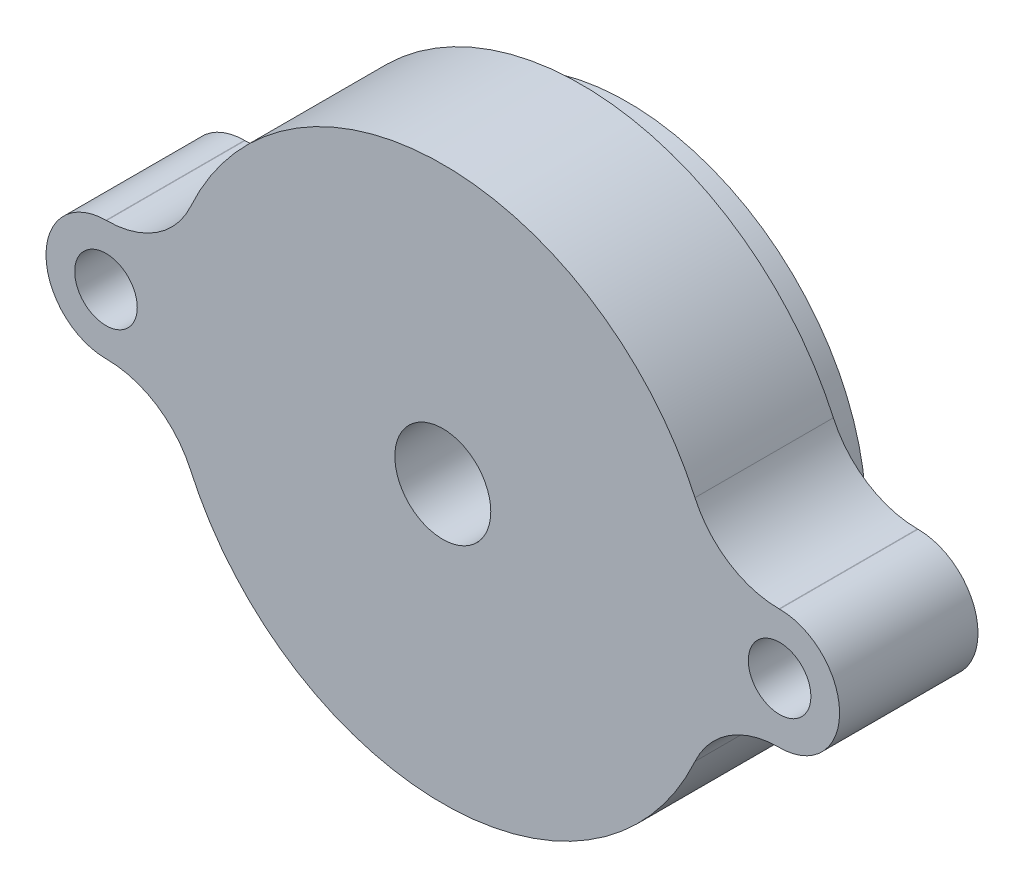
ISO-10303-21;
HEADER;
FILE_DESCRIPTION(('STEP AP214'),'2;1');
FILE_NAME('part.step','',(''),(''),'','','');
FILE_SCHEMA(('AUTOMOTIVE_DESIGN { 1 0 10303 214 1 1 1 1 }'));
ENDSEC;
DATA;
#1=APPLICATION_CONTEXT('core data for automotive mechanical design processes');
#2=APPLICATION_PROTOCOL_DEFINITION('international standard','automotive_design',2000,#1);
#3=PRODUCT_CONTEXT('',#1,'mechanical');
#4=PRODUCT('Part','Part','',(#3));
#5=PRODUCT_RELATED_PRODUCT_CATEGORY('part','',(#4));
#6=PRODUCT_DEFINITION_FORMATION('','',#4);
#7=PRODUCT_DEFINITION_CONTEXT('part definition',#1,'design');
#8=PRODUCT_DEFINITION('design','',#6,#7);
#9=PRODUCT_DEFINITION_SHAPE('','',#8);
#10=(LENGTH_UNIT() NAMED_UNIT(*) SI_UNIT(.MILLI.,.METRE.));
#11=(NAMED_UNIT(*) PLANE_ANGLE_UNIT() SI_UNIT($,.RADIAN.));
#12=(NAMED_UNIT(*) SI_UNIT($,.STERADIAN.) SOLID_ANGLE_UNIT());
#13=UNCERTAINTY_MEASURE_WITH_UNIT(LENGTH_MEASURE(1.E-05),#10,'distance_accuracy_value','');
#14=(GEOMETRIC_REPRESENTATION_CONTEXT(3) GLOBAL_UNCERTAINTY_ASSIGNED_CONTEXT((#13)) GLOBAL_UNIT_ASSIGNED_CONTEXT((#10,
#11,#12)) REPRESENTATION_CONTEXT('',''));
#15=CARTESIAN_POINT('',(0.,0.,0.));
#16=DIRECTION('',(0.,0.,1.));
#17=DIRECTION('',(1.,0.,0.));
#18=AXIS2_PLACEMENT_3D('',#15,#16,#17);
#19=CARTESIAN_POINT('',(23.1775,0.,3.175));
#20=DIRECTION('',(0.,0.,1.));
#21=DIRECTION('',(1.,0.,0.));
#22=AXIS2_PLACEMENT_3D('',#19,#20,#21);
#23=PLANE('',#22);
#24=CARTESIAN_POINT('',(23.1775,0.,3.175));
#25=DIRECTION('',(0.,0.,-1.));
#26=DIRECTION('',(-1.,0.,0.));
#27=AXIS2_PLACEMENT_3D('',#24,#25,#26);
#28=CIRCLE('',#27,2.65430000000001);
#29=CARTESIAN_POINT('',(20.5232,0.,3.175));
#30=VERTEX_POINT('',#29);
#31=EDGE_CURVE('E252',#30,#30,#28,.T.);
#32=ORIENTED_EDGE('',*,*,#31,.F.);
#33=EDGE_LOOP('',(#32));
#34=FACE_BOUND('',#33,.T.);
#35=CARTESIAN_POINT('',(-23.1775,0.,3.175));
#36=DIRECTION('',(0.,0.,-1.));
#37=DIRECTION('',(-1.,0.,0.));
#38=AXIS2_PLACEMENT_3D('',#35,#36,#37);
#39=CIRCLE('',#38,2.65430000000001);
#40=CARTESIAN_POINT('',(-25.8318,0.,3.175));
#41=VERTEX_POINT('',#40);
#42=EDGE_CURVE('E242',#41,#41,#39,.T.);
#43=ORIENTED_EDGE('',*,*,#42,.F.);
#44=EDGE_LOOP('',(#43));
#45=FACE_BOUND('',#44,.T.);
#46=CARTESIAN_POINT('',(0.,0.,3.175));
#47=DIRECTION('',(0.,0.,1.));
#48=DIRECTION('',(1.,0.,0.));
#49=AXIS2_PLACEMENT_3D('',#46,#47,#48);
#50=CIRCLE('',#49,16.4211);
#51=CARTESIAN_POINT('',(16.4211,0.,3.175));
#52=VERTEX_POINT('',#51);
#53=EDGE_CURVE('E12',#52,#52,#50,.T.);
#54=ORIENTED_EDGE('',*,*,#53,.T.);
#55=EDGE_LOOP('',(#54));
#56=FACE_BOUND('',#55,.T.);
#57=CARTESIAN_POINT('',(23.1775,0.,3.175));
#58=DIRECTION('',(0.,0.,1.));
#59=DIRECTION('',(1.,0.,0.));
#60=AXIS2_PLACEMENT_3D('',#57,#58,#59);
#61=CIRCLE('',#60,4.1275);
#62=CARTESIAN_POINT('',(23.1775,-4.1275,3.175));
#63=VERTEX_POINT('',#62);
#64=CARTESIAN_POINT('',(23.1775,4.1275,3.175));
#65=VERTEX_POINT('',#64);
#66=EDGE_CURVE('E149',#63,#65,#61,.T.);
#67=ORIENTED_EDGE('',*,*,#66,.F.);
#68=DIRECTION('',(1.,0.,0.));
#69=VECTOR('',#68,1.);
#70=CARTESIAN_POINT('',(23.1383230539726,-4.1275,3.175));
#71=LINE('',#70,#69);
#72=CARTESIAN_POINT('',(23.1383230539726,-4.1275,3.175));
#73=VERTEX_POINT('',#72);
#74=EDGE_CURVE('E189',#73,#63,#71,.T.);
#75=ORIENTED_EDGE('',*,*,#74,.F.);
#76=CARTESIAN_POINT('',(23.1383230539726,-10.4775,3.175));
#77=DIRECTION('',(0.,0.,-1.));
#78=DIRECTION('',(1.,0.,0.));
#79=AXIS2_PLACEMENT_3D('',#76,#77,#78);
#80=CIRCLE('',#79,6.35);
#81=CARTESIAN_POINT('',(17.3537422904795,-7.85812500000001,3.175));
#82=VERTEX_POINT('',#81);
#83=EDGE_CURVE('E186',#82,#73,#80,.T.);
#84=ORIENTED_EDGE('',*,*,#83,.F.);
#85=CARTESIAN_POINT('',(0.,0.,3.175));
#86=DIRECTION('',(0.,0.,1.));
#87=DIRECTION('',(1.,0.,0.));
#88=AXIS2_PLACEMENT_3D('',#85,#86,#87);
#89=CIRCLE('',#88,19.05);
#90=CARTESIAN_POINT('',(-17.3537422904795,-7.858125,3.175));
#91=VERTEX_POINT('',#90);
#92=EDGE_CURVE('E183',#91,#82,#89,.T.);
#93=ORIENTED_EDGE('',*,*,#92,.F.);
#94=CARTESIAN_POINT('',(-23.1383230539726,-10.4775,3.175));
#95=DIRECTION('',(0.,0.,-1.));
#96=DIRECTION('',(1.,0.,0.));
#97=AXIS2_PLACEMENT_3D('',#94,#95,#96);
#98=CIRCLE('',#97,6.35);
#99=CARTESIAN_POINT('',(-23.1383230539726,-4.1275,3.175));
#100=VERTEX_POINT('',#99);
#101=EDGE_CURVE('E180',#100,#91,#98,.T.);
#102=ORIENTED_EDGE('',*,*,#101,.F.);
#103=DIRECTION('',(1.,0.,0.));
#104=VECTOR('',#103,1.);
#105=CARTESIAN_POINT('',(-23.1775,-4.1275,3.175));
#106=LINE('',#105,#104);
#107=CARTESIAN_POINT('',(-23.1775,-4.1275,3.175));
#108=VERTEX_POINT('',#107);
#109=EDGE_CURVE('E177',#108,#100,#106,.T.);
#110=ORIENTED_EDGE('',*,*,#109,.F.);
#111=CARTESIAN_POINT('',(-23.1775,0.,3.175));
#112=DIRECTION('',(0.,0.,1.));
#113=DIRECTION('',(1.,0.,0.));
#114=AXIS2_PLACEMENT_3D('',#111,#112,#113);
#115=CIRCLE('',#114,4.1275);
#116=CARTESIAN_POINT('',(-23.1775,4.1275,3.175));
#117=VERTEX_POINT('',#116);
#118=EDGE_CURVE('E174',#117,#108,#115,.T.);
#119=ORIENTED_EDGE('',*,*,#118,.F.);
#120=DIRECTION('',(-1.,0.,0.));
#121=VECTOR('',#120,1.);
#122=CARTESIAN_POINT('',(-23.1383230539726,4.1275,3.175));
#123=LINE('',#122,#121);
#124=CARTESIAN_POINT('',(-23.1383230539726,4.1275,3.175));
#125=VERTEX_POINT('',#124);
#126=EDGE_CURVE('E171',#125,#117,#123,.T.);
#127=ORIENTED_EDGE('',*,*,#126,.F.);
#128=CARTESIAN_POINT('',(-23.1383230539726,10.4775,3.175));
#129=DIRECTION('',(0.,0.,-1.));
#130=DIRECTION('',(1.,0.,0.));
#131=AXIS2_PLACEMENT_3D('',#128,#129,#130);
#132=CIRCLE('',#131,6.35);
#133=CARTESIAN_POINT('',(-17.3537422904795,7.858125,3.175));
#134=VERTEX_POINT('',#133);
#135=EDGE_CURVE('E168',#134,#125,#132,.T.);
#136=ORIENTED_EDGE('',*,*,#135,.F.);
#137=CARTESIAN_POINT('',(0.,0.,3.175));
#138=DIRECTION('',(0.,0.,1.));
#139=DIRECTION('',(1.,0.,0.));
#140=AXIS2_PLACEMENT_3D('',#137,#138,#139);
#141=CIRCLE('',#140,19.05);
#142=CARTESIAN_POINT('',(17.3537422904795,7.858125,3.175));
#143=VERTEX_POINT('',#142);
#144=EDGE_CURVE('E165',#143,#134,#141,.T.);
#145=ORIENTED_EDGE('',*,*,#144,.F.);
#146=CARTESIAN_POINT('',(23.1383230539726,10.4775,3.175));
#147=DIRECTION('',(0.,0.,-1.));
#148=DIRECTION('',(1.,0.,0.));
#149=AXIS2_PLACEMENT_3D('',#146,#147,#148);
#150=CIRCLE('',#149,6.35);
#151=CARTESIAN_POINT('',(23.1383230539726,4.1275,3.175));
#152=VERTEX_POINT('',#151);
#153=EDGE_CURVE('E153',#152,#143,#150,.T.);
#154=ORIENTED_EDGE('',*,*,#153,.F.);
#155=DIRECTION('',(-1.,0.,0.));
#156=VECTOR('',#155,1.);
#157=CARTESIAN_POINT('',(23.1775,4.1275,3.175));
#158=LINE('',#157,#156);
#159=EDGE_CURVE('E137',#65,#152,#158,.T.);
#160=ORIENTED_EDGE('',*,*,#159,.F.);
#161=EDGE_LOOP('',(#67,#75,#84,#93,#102,#110,#119,#127,#136,#145,#154,#160));
#162=FACE_BOUND('',#161,.T.);
#163=ADVANCED_FACE('F42',(#34,#45,#56,#162),#23,.F.);
#164=CARTESIAN_POINT('',(0.,0.,6.35));
#165=DIRECTION('',(0.,0.,-1.));
#166=DIRECTION('',(-1.,0.,0.));
#167=AXIS2_PLACEMENT_3D('',#164,#165,#166);
#168=CYLINDRICAL_SURFACE('',#167,16.4211);
#169=CARTESIAN_POINT('',(0.,0.,0.));
#170=DIRECTION('',(0.,0.,1.));
#171=DIRECTION('',(1.,0.,0.));
#172=AXIS2_PLACEMENT_3D('',#169,#170,#171);
#173=CIRCLE('',#172,16.4211);
#174=CARTESIAN_POINT('',(16.4211,0.,0.));
#175=VERTEX_POINT('',#174);
#176=EDGE_CURVE('E51',#175,#175,#173,.T.);
#177=ORIENTED_EDGE('',*,*,#176,.T.);
#178=EDGE_LOOP('',(#177));
#179=FACE_BOUND('',#178,.T.);
#180=ORIENTED_EDGE('',*,*,#53,.F.);
#181=EDGE_LOOP('',(#180));
#182=FACE_BOUND('',#181,.T.);
#183=ADVANCED_FACE('F277',(#179,#182),#168,.T.);
#184=CARTESIAN_POINT('',(0.,0.,6.35));
#185=DIRECTION('',(0.,0.,-1.));
#186=DIRECTION('',(-1.,0.,0.));
#187=AXIS2_PLACEMENT_3D('',#184,#185,#186);
#188=CYLINDRICAL_SURFACE('',#187,3.302);
#189=CARTESIAN_POINT('',(0.,0.,0.));
#190=DIRECTION('',(0.,0.,1.));
#191=DIRECTION('',(1.,0.,0.));
#192=AXIS2_PLACEMENT_3D('',#189,#190,#191);
#193=CIRCLE('',#192,3.302);
#194=CARTESIAN_POINT('',(3.302,0.,0.));
#195=VERTEX_POINT('',#194);
#196=EDGE_CURVE('E142',#195,#195,#193,.T.);
#197=ORIENTED_EDGE('',*,*,#196,.F.);
#198=EDGE_LOOP('',(#197));
#199=FACE_BOUND('',#198,.T.);
#200=CARTESIAN_POINT('',(0.,0.,12.7));
#201=DIRECTION('',(0.,0.,1.));
#202=DIRECTION('',(1.,0.,0.));
#203=AXIS2_PLACEMENT_3D('',#200,#201,#202);
#204=CIRCLE('',#203,3.302);
#205=CARTESIAN_POINT('',(3.302,0.,12.7));
#206=VERTEX_POINT('',#205);
#207=EDGE_CURVE('E255',#206,#206,#204,.T.);
#208=ORIENTED_EDGE('',*,*,#207,.T.);
#209=EDGE_LOOP('',(#208));
#210=FACE_BOUND('',#209,.T.);
#211=ADVANCED_FACE('F44',(#199,#210),#188,.F.);
#212=CARTESIAN_POINT('',(0.,0.,0.));
#213=DIRECTION('',(0.,0.,1.));
#214=DIRECTION('',(1.,0.,0.));
#215=AXIS2_PLACEMENT_3D('',#212,#213,#214);
#216=PLANE('',#215);
#217=ORIENTED_EDGE('',*,*,#196,.T.);
#218=EDGE_LOOP('',(#217));
#219=FACE_BOUND('',#218,.T.);
#220=ORIENTED_EDGE('',*,*,#176,.F.);
#221=EDGE_LOOP('',(#220));
#222=FACE_BOUND('',#221,.T.);
#223=ADVANCED_FACE('F262',(#219,#222),#216,.F.);
#224=CARTESIAN_POINT('',(23.1775,0.,12.7));
#225=DIRECTION('',(0.,0.,1.));
#226=DIRECTION('',(1.,0.,0.));
#227=AXIS2_PLACEMENT_3D('',#224,#225,#226);
#228=PLANE('',#227);
#229=CARTESIAN_POINT('',(23.1775,0.,12.7));
#230=DIRECTION('',(0.,0.,1.));
#231=DIRECTION('',(1.,0.,0.));
#232=AXIS2_PLACEMENT_3D('',#229,#230,#231);
#233=CIRCLE('',#232,2.15264999999999);
#234=CARTESIAN_POINT('',(25.33015,0.,12.7));
#235=VERTEX_POINT('',#234);
#236=EDGE_CURVE('E160',#235,#235,#233,.T.);
#237=ORIENTED_EDGE('',*,*,#236,.F.);
#238=EDGE_LOOP('',(#237));
#239=FACE_BOUND('',#238,.T.);
#240=CARTESIAN_POINT('',(-23.1775,0.,12.7));
#241=DIRECTION('',(0.,0.,1.));
#242=DIRECTION('',(1.,0.,0.));
#243=AXIS2_PLACEMENT_3D('',#240,#241,#242);
#244=CIRCLE('',#243,2.15264999999999);
#245=CARTESIAN_POINT('',(-21.02485,0.,12.7));
#246=VERTEX_POINT('',#245);
#247=EDGE_CURVE('E157',#246,#246,#244,.T.);
#248=ORIENTED_EDGE('',*,*,#247,.F.);
#249=EDGE_LOOP('',(#248));
#250=FACE_BOUND('',#249,.T.);
#251=CARTESIAN_POINT('',(23.1775,0.,12.7));
#252=DIRECTION('',(0.,0.,1.));
#253=DIRECTION('',(1.,0.,0.));
#254=AXIS2_PLACEMENT_3D('',#251,#252,#253);
#255=CIRCLE('',#254,4.1275);
#256=CARTESIAN_POINT('',(23.1775,-4.1275,12.7));
#257=VERTEX_POINT('',#256);
#258=CARTESIAN_POINT('',(23.1775,4.1275,12.7));
#259=VERTEX_POINT('',#258);
#260=EDGE_CURVE('E191',#257,#259,#255,.T.);
#261=ORIENTED_EDGE('',*,*,#260,.T.);
#262=DIRECTION('',(-1.,0.,0.));
#263=VECTOR('',#262,1.);
#264=CARTESIAN_POINT('',(23.1775,4.1275,12.7));
#265=LINE('',#264,#263);
#266=CARTESIAN_POINT('',(23.1383230539726,4.1275,12.7));
#267=VERTEX_POINT('',#266);
#268=EDGE_CURVE('E138',#259,#267,#265,.T.);
#269=ORIENTED_EDGE('',*,*,#268,.T.);
#270=CARTESIAN_POINT('',(23.1383230539726,10.4775,12.7));
#271=DIRECTION('',(0.,0.,-1.));
#272=DIRECTION('',(1.,0.,0.));
#273=AXIS2_PLACEMENT_3D('',#270,#271,#272);
#274=CIRCLE('',#273,6.35);
#275=CARTESIAN_POINT('',(17.3537422904795,7.858125,12.7));
#276=VERTEX_POINT('',#275);
#277=EDGE_CURVE('E194',#267,#276,#274,.T.);
#278=ORIENTED_EDGE('',*,*,#277,.T.);
#279=CARTESIAN_POINT('',(0.,0.,12.7));
#280=DIRECTION('',(0.,0.,1.));
#281=DIRECTION('',(1.,0.,0.));
#282=AXIS2_PLACEMENT_3D('',#279,#280,#281);
#283=CIRCLE('',#282,19.05);
#284=CARTESIAN_POINT('',(-17.3537422904795,7.858125,12.7));
#285=VERTEX_POINT('',#284);
#286=EDGE_CURVE('E196',#276,#285,#283,.T.);
#287=ORIENTED_EDGE('',*,*,#286,.T.);
#288=CARTESIAN_POINT('',(-23.1383230539726,10.4775,12.7));
#289=DIRECTION('',(0.,0.,-1.));
#290=DIRECTION('',(1.,0.,0.));
#291=AXIS2_PLACEMENT_3D('',#288,#289,#290);
#292=CIRCLE('',#291,6.35);
#293=CARTESIAN_POINT('',(-23.1383230539726,4.1275,12.7));
#294=VERTEX_POINT('',#293);
#295=EDGE_CURVE('E198',#285,#294,#292,.T.);
#296=ORIENTED_EDGE('',*,*,#295,.T.);
#297=DIRECTION('',(-1.,0.,0.));
#298=VECTOR('',#297,1.);
#299=CARTESIAN_POINT('',(-23.1383230539726,4.1275,12.7));
#300=LINE('',#299,#298);
#301=CARTESIAN_POINT('',(-23.1775,4.1275,12.7));
#302=VERTEX_POINT('',#301);
#303=EDGE_CURVE('E200',#294,#302,#300,.T.);
#304=ORIENTED_EDGE('',*,*,#303,.T.);
#305=CARTESIAN_POINT('',(-23.1775,0.,12.7));
#306=DIRECTION('',(0.,0.,1.));
#307=DIRECTION('',(1.,0.,0.));
#308=AXIS2_PLACEMENT_3D('',#305,#306,#307);
#309=CIRCLE('',#308,4.1275);
#310=CARTESIAN_POINT('',(-23.1775,-4.1275,12.7));
#311=VERTEX_POINT('',#310);
#312=EDGE_CURVE('E202',#302,#311,#309,.T.);
#313=ORIENTED_EDGE('',*,*,#312,.T.);
#314=DIRECTION('',(1.,0.,0.));
#315=VECTOR('',#314,1.);
#316=CARTESIAN_POINT('',(-23.1775,-4.1275,12.7));
#317=LINE('',#316,#315);
#318=CARTESIAN_POINT('',(-23.1383230539726,-4.1275,12.7));
#319=VERTEX_POINT('',#318);
#320=EDGE_CURVE('E204',#311,#319,#317,.T.);
#321=ORIENTED_EDGE('',*,*,#320,.T.);
#322=CARTESIAN_POINT('',(-23.1383230539726,-10.4775,12.7));
#323=DIRECTION('',(0.,0.,-1.));
#324=DIRECTION('',(1.,0.,0.));
#325=AXIS2_PLACEMENT_3D('',#322,#323,#324);
#326=CIRCLE('',#325,6.35);
#327=CARTESIAN_POINT('',(-17.3537422904795,-7.858125,12.7));
#328=VERTEX_POINT('',#327);
#329=EDGE_CURVE('E206',#319,#328,#326,.T.);
#330=ORIENTED_EDGE('',*,*,#329,.T.);
#331=CARTESIAN_POINT('',(0.,0.,12.7));
#332=DIRECTION('',(0.,0.,1.));
#333=DIRECTION('',(1.,0.,0.));
#334=AXIS2_PLACEMENT_3D('',#331,#332,#333);
#335=CIRCLE('',#334,19.05);
#336=CARTESIAN_POINT('',(17.3537422904795,-7.85812500000001,12.7));
#337=VERTEX_POINT('',#336);
#338=EDGE_CURVE('E208',#328,#337,#335,.T.);
#339=ORIENTED_EDGE('',*,*,#338,.T.);
#340=CARTESIAN_POINT('',(23.1383230539726,-10.4775,12.7));
#341=DIRECTION('',(0.,0.,-1.));
#342=DIRECTION('',(1.,0.,0.));
#343=AXIS2_PLACEMENT_3D('',#340,#341,#342);
#344=CIRCLE('',#343,6.35);
#345=CARTESIAN_POINT('',(23.1383230539726,-4.1275,12.7));
#346=VERTEX_POINT('',#345);
#347=EDGE_CURVE('E64',#337,#346,#344,.T.);
#348=ORIENTED_EDGE('',*,*,#347,.T.);
#349=DIRECTION('',(1.,0.,0.));
#350=VECTOR('',#349,1.);
#351=CARTESIAN_POINT('',(23.1383230539726,-4.1275,12.7));
#352=LINE('',#351,#350);
#353=EDGE_CURVE('E59',#346,#257,#352,.T.);
#354=ORIENTED_EDGE('',*,*,#353,.T.);
#355=EDGE_LOOP('',(#261,#269,#278,#287,#296,#304,#313,#321,#330,#339,#348,#354));
#356=FACE_BOUND('',#355,.T.);
#357=ORIENTED_EDGE('',*,*,#207,.F.);
#358=EDGE_LOOP('',(#357));
#359=FACE_BOUND('',#358,.T.);
#360=ADVANCED_FACE('F260',(#239,#250,#356,#359),#228,.T.);
#361=CARTESIAN_POINT('',(23.1775,0.,12.7));
#362=DIRECTION('',(0.,0.,-1.));
#363=DIRECTION('',(-1.,0.,0.));
#364=AXIS2_PLACEMENT_3D('',#361,#362,#363);
#365=CYLINDRICAL_SURFACE('',#364,4.1275);
#366=DIRECTION('',(0.,0.,-1.));
#367=VECTOR('',#366,1.);
#368=CARTESIAN_POINT('',(23.1775,-4.1275,12.7));
#369=LINE('',#368,#367);
#370=EDGE_CURVE('E156',#257,#63,#369,.T.);
#371=ORIENTED_EDGE('',*,*,#370,.T.);
#372=ORIENTED_EDGE('',*,*,#66,.T.);
#373=DIRECTION('',(0.,0.,-1.));
#374=VECTOR('',#373,1.);
#375=CARTESIAN_POINT('',(23.1775,4.1275,12.7));
#376=LINE('',#375,#374);
#377=EDGE_CURVE('E133',#259,#65,#376,.T.);
#378=ORIENTED_EDGE('',*,*,#377,.F.);
#379=ORIENTED_EDGE('',*,*,#260,.F.);
#380=EDGE_LOOP('',(#371,#372,#378,#379));
#381=FACE_BOUND('',#380,.T.);
#382=ADVANCED_FACE('F155',(#381),#365,.T.);
#383=CARTESIAN_POINT('',(23.1775,4.1275,12.7));
#384=DIRECTION('',(0.,-1.,0.));
#385=DIRECTION('',(0.,0.,-1.));
#386=AXIS2_PLACEMENT_3D('',#383,#384,#385);
#387=PLANE('',#386);
#388=ORIENTED_EDGE('',*,*,#377,.T.);
#389=ORIENTED_EDGE('',*,*,#159,.T.);
#390=DIRECTION('',(0.,0.,-1.));
#391=VECTOR('',#390,1.);
#392=CARTESIAN_POINT('',(23.1383230539726,4.1275,12.7));
#393=LINE('',#392,#391);
#394=EDGE_CURVE('E143',#267,#152,#393,.T.);
#395=ORIENTED_EDGE('',*,*,#394,.F.);
#396=ORIENTED_EDGE('',*,*,#268,.F.);
#397=EDGE_LOOP('',(#388,#389,#395,#396));
#398=FACE_BOUND('',#397,.T.);
#399=ADVANCED_FACE('F135',(#398),#387,.F.);
#400=CARTESIAN_POINT('',(23.1383230539726,10.4775,12.7));
#401=DIRECTION('',(0.,0.,-1.));
#402=DIRECTION('',(-1.,0.,0.));
#403=AXIS2_PLACEMENT_3D('',#400,#401,#402);
#404=CYLINDRICAL_SURFACE('',#403,6.35);
#405=ORIENTED_EDGE('',*,*,#394,.T.);
#406=ORIENTED_EDGE('',*,*,#153,.T.);
#407=DIRECTION('',(0.,0.,-1.));
#408=VECTOR('',#407,1.);
#409=CARTESIAN_POINT('',(17.3537422904795,7.858125,12.7));
#410=LINE('',#409,#408);
#411=EDGE_CURVE('E229',#276,#143,#410,.T.);
#412=ORIENTED_EDGE('',*,*,#411,.F.);
#413=ORIENTED_EDGE('',*,*,#277,.F.);
#414=EDGE_LOOP('',(#405,#406,#412,#413));
#415=FACE_BOUND('',#414,.T.);
#416=ADVANCED_FACE('F405',(#415),#404,.F.);
#417=CARTESIAN_POINT('',(0.,0.,12.7));
#418=DIRECTION('',(0.,0.,-1.));
#419=DIRECTION('',(-1.,0.,0.));
#420=AXIS2_PLACEMENT_3D('',#417,#418,#419);
#421=CYLINDRICAL_SURFACE('',#420,19.05);
#422=ORIENTED_EDGE('',*,*,#411,.T.);
#423=ORIENTED_EDGE('',*,*,#144,.T.);
#424=DIRECTION('',(0.,0.,-1.));
#425=VECTOR('',#424,1.);
#426=CARTESIAN_POINT('',(-17.3537422904795,7.858125,12.7));
#427=LINE('',#426,#425);
#428=EDGE_CURVE('E227',#285,#134,#427,.T.);
#429=ORIENTED_EDGE('',*,*,#428,.F.);
#430=ORIENTED_EDGE('',*,*,#286,.F.);
#431=EDGE_LOOP('',(#422,#423,#429,#430));
#432=FACE_BOUND('',#431,.T.);
#433=ADVANCED_FACE('F397',(#432),#421,.T.);
#434=CARTESIAN_POINT('',(-23.1383230539726,10.4775,12.7));
#435=DIRECTION('',(0.,0.,-1.));
#436=DIRECTION('',(-1.,0.,0.));
#437=AXIS2_PLACEMENT_3D('',#434,#435,#436);
#438=CYLINDRICAL_SURFACE('',#437,6.35);
#439=ORIENTED_EDGE('',*,*,#428,.T.);
#440=ORIENTED_EDGE('',*,*,#135,.T.);
#441=DIRECTION('',(0.,0.,-1.));
#442=VECTOR('',#441,1.);
#443=CARTESIAN_POINT('',(-23.1383230539726,4.1275,12.7));
#444=LINE('',#443,#442);
#445=EDGE_CURVE('E225',#294,#125,#444,.T.);
#446=ORIENTED_EDGE('',*,*,#445,.F.);
#447=ORIENTED_EDGE('',*,*,#295,.F.);
#448=EDGE_LOOP('',(#439,#440,#446,#447));
#449=FACE_BOUND('',#448,.T.);
#450=ADVANCED_FACE('F389',(#449),#438,.F.);
#451=CARTESIAN_POINT('',(-23.1383230539726,4.1275,12.7));
#452=DIRECTION('',(0.,-1.,0.));
#453=DIRECTION('',(1.,0.,0.));
#454=AXIS2_PLACEMENT_3D('',#451,#452,#453);
#455=PLANE('',#454);
#456=ORIENTED_EDGE('',*,*,#445,.T.);
#457=ORIENTED_EDGE('',*,*,#126,.T.);
#458=DIRECTION('',(0.,0.,-1.));
#459=VECTOR('',#458,1.);
#460=CARTESIAN_POINT('',(-23.1775,4.1275,12.7));
#461=LINE('',#460,#459);
#462=EDGE_CURVE('E223',#302,#117,#461,.T.);
#463=ORIENTED_EDGE('',*,*,#462,.F.);
#464=ORIENTED_EDGE('',*,*,#303,.F.);
#465=EDGE_LOOP('',(#456,#457,#463,#464));
#466=FACE_BOUND('',#465,.T.);
#467=ADVANCED_FACE('F381',(#466),#455,.F.);
#468=CARTESIAN_POINT('',(-23.1775,0.,12.7));
#469=DIRECTION('',(0.,0.,-1.));
#470=DIRECTION('',(-1.,0.,0.));
#471=AXIS2_PLACEMENT_3D('',#468,#469,#470);
#472=CYLINDRICAL_SURFACE('',#471,4.1275);
#473=ORIENTED_EDGE('',*,*,#462,.T.);
#474=ORIENTED_EDGE('',*,*,#118,.T.);
#475=DIRECTION('',(0.,0.,-1.));
#476=VECTOR('',#475,1.);
#477=CARTESIAN_POINT('',(-23.1775,-4.1275,12.7));
#478=LINE('',#477,#476);
#479=EDGE_CURVE('E221',#311,#108,#478,.T.);
#480=ORIENTED_EDGE('',*,*,#479,.F.);
#481=ORIENTED_EDGE('',*,*,#312,.F.);
#482=EDGE_LOOP('',(#473,#474,#480,#481));
#483=FACE_BOUND('',#482,.T.);
#484=ADVANCED_FACE('F373',(#483),#472,.T.);
#485=CARTESIAN_POINT('',(-23.1775,-4.1275,12.7));
#486=DIRECTION('',(0.,1.,0.));
#487=DIRECTION('',(0.,0.,1.));
#488=AXIS2_PLACEMENT_3D('',#485,#486,#487);
#489=PLANE('',#488);
#490=ORIENTED_EDGE('',*,*,#479,.T.);
#491=ORIENTED_EDGE('',*,*,#109,.T.);
#492=DIRECTION('',(0.,0.,-1.));
#493=VECTOR('',#492,1.);
#494=CARTESIAN_POINT('',(-23.1383230539726,-4.1275,12.7));
#495=LINE('',#494,#493);
#496=EDGE_CURVE('E219',#319,#100,#495,.T.);
#497=ORIENTED_EDGE('',*,*,#496,.F.);
#498=ORIENTED_EDGE('',*,*,#320,.F.);
#499=EDGE_LOOP('',(#490,#491,#497,#498));
#500=FACE_BOUND('',#499,.T.);
#501=ADVANCED_FACE('F365',(#500),#489,.F.);
#502=CARTESIAN_POINT('',(-23.1383230539726,-10.4775,12.7));
#503=DIRECTION('',(0.,0.,-1.));
#504=DIRECTION('',(-1.,0.,0.));
#505=AXIS2_PLACEMENT_3D('',#502,#503,#504);
#506=CYLINDRICAL_SURFACE('',#505,6.35);
#507=ORIENTED_EDGE('',*,*,#496,.T.);
#508=ORIENTED_EDGE('',*,*,#101,.T.);
#509=DIRECTION('',(0.,0.,-1.));
#510=VECTOR('',#509,1.);
#511=CARTESIAN_POINT('',(-17.3537422904795,-7.858125,12.7));
#512=LINE('',#511,#510);
#513=EDGE_CURVE('E217',#328,#91,#512,.T.);
#514=ORIENTED_EDGE('',*,*,#513,.F.);
#515=ORIENTED_EDGE('',*,*,#329,.F.);
#516=EDGE_LOOP('',(#507,#508,#514,#515));
#517=FACE_BOUND('',#516,.T.);
#518=ADVANCED_FACE('F357',(#517),#506,.F.);
#519=CARTESIAN_POINT('',(0.,0.,12.7));
#520=DIRECTION('',(0.,0.,-1.));
#521=DIRECTION('',(-1.,0.,0.));
#522=AXIS2_PLACEMENT_3D('',#519,#520,#521);
#523=CYLINDRICAL_SURFACE('',#522,19.05);
#524=ORIENTED_EDGE('',*,*,#513,.T.);
#525=ORIENTED_EDGE('',*,*,#92,.T.);
#526=DIRECTION('',(0.,0.,-1.));
#527=VECTOR('',#526,1.);
#528=CARTESIAN_POINT('',(17.3537422904795,-7.85812500000001,12.7));
#529=LINE('',#528,#527);
#530=EDGE_CURVE('E215',#337,#82,#529,.T.);
#531=ORIENTED_EDGE('',*,*,#530,.F.);
#532=ORIENTED_EDGE('',*,*,#338,.F.);
#533=EDGE_LOOP('',(#524,#525,#531,#532));
#534=FACE_BOUND('',#533,.T.);
#535=ADVANCED_FACE('F349',(#534),#523,.T.);
#536=CARTESIAN_POINT('',(23.1383230539726,-10.4775,12.7));
#537=DIRECTION('',(0.,0.,-1.));
#538=DIRECTION('',(-1.,0.,0.));
#539=AXIS2_PLACEMENT_3D('',#536,#537,#538);
#540=CYLINDRICAL_SURFACE('',#539,6.35);
#541=ORIENTED_EDGE('',*,*,#530,.T.);
#542=ORIENTED_EDGE('',*,*,#83,.T.);
#543=DIRECTION('',(0.,0.,-1.));
#544=VECTOR('',#543,1.);
#545=CARTESIAN_POINT('',(23.1383230539726,-4.1275,12.7));
#546=LINE('',#545,#544);
#547=EDGE_CURVE('E213',#346,#73,#546,.T.);
#548=ORIENTED_EDGE('',*,*,#547,.F.);
#549=ORIENTED_EDGE('',*,*,#347,.F.);
#550=EDGE_LOOP('',(#541,#542,#548,#549));
#551=FACE_BOUND('',#550,.T.);
#552=ADVANCED_FACE('F342',(#551),#540,.F.);
#553=CARTESIAN_POINT('',(23.1383230539726,-4.1275,12.7));
#554=DIRECTION('',(0.,1.,0.));
#555=DIRECTION('',(-1.,0.,0.));
#556=AXIS2_PLACEMENT_3D('',#553,#554,#555);
#557=PLANE('',#556);
#558=ORIENTED_EDGE('',*,*,#547,.T.);
#559=ORIENTED_EDGE('',*,*,#74,.T.);
#560=ORIENTED_EDGE('',*,*,#370,.F.);
#561=ORIENTED_EDGE('',*,*,#353,.F.);
#562=EDGE_LOOP('',(#558,#559,#560,#561));
#563=FACE_BOUND('',#562,.T.);
#564=ADVANCED_FACE('F290',(#563),#557,.F.);
#565=CARTESIAN_POINT('',(-23.1775,0.,3.175));
#566=DIRECTION('',(0.,0.,-1.));
#567=DIRECTION('',(-1.,0.,0.));
#568=AXIS2_PLACEMENT_3D('',#565,#566,#567);
#569=CYLINDRICAL_SURFACE('',#568,2.15264999999999);
#570=CARTESIAN_POINT('',(-23.1775,0.,6.98499999999999));
#571=DIRECTION('',(0.,0.,1.));
#572=DIRECTION('',(1.,0.,0.));
#573=AXIS2_PLACEMENT_3D('',#570,#571,#572);
#574=CIRCLE('',#573,2.15264999999999);
#575=CARTESIAN_POINT('',(-21.02485,0.,6.98499999999999));
#576=VERTEX_POINT('',#575);
#577=EDGE_CURVE('E235',#576,#576,#574,.F.);
#578=ORIENTED_EDGE('',*,*,#577,.T.);
#579=EDGE_LOOP('',(#578));
#580=FACE_BOUND('',#579,.T.);
#581=ORIENTED_EDGE('',*,*,#247,.T.);
#582=EDGE_LOOP('',(#581));
#583=FACE_BOUND('',#582,.T.);
#584=ADVANCED_FACE('F286',(#580,#583),#569,.F.);
#585=CARTESIAN_POINT('',(23.1775,0.,3.175));
#586=DIRECTION('',(0.,0.,-1.));
#587=DIRECTION('',(-1.,0.,0.));
#588=AXIS2_PLACEMENT_3D('',#585,#586,#587);
#589=CYLINDRICAL_SURFACE('',#588,2.15264999999999);
#590=CARTESIAN_POINT('',(23.1775,0.,6.98499999999999));
#591=DIRECTION('',(0.,0.,1.));
#592=DIRECTION('',(1.,0.,0.));
#593=AXIS2_PLACEMENT_3D('',#590,#591,#592);
#594=CIRCLE('',#593,2.15264999999999);
#595=CARTESIAN_POINT('',(25.33015,0.,6.98499999999999));
#596=VERTEX_POINT('',#595);
#597=EDGE_CURVE('E46',#596,#596,#594,.F.);
#598=ORIENTED_EDGE('',*,*,#597,.T.);
#599=EDGE_LOOP('',(#598));
#600=FACE_BOUND('',#599,.T.);
#601=ORIENTED_EDGE('',*,*,#236,.T.);
#602=EDGE_LOOP('',(#601));
#603=FACE_BOUND('',#602,.T.);
#604=ADVANCED_FACE('F289',(#600,#603),#589,.F.);
#605=CARTESIAN_POINT('',(-23.1775,0.,6.98499999999999));
#606=DIRECTION('',(0.,0.,1.));
#607=DIRECTION('',(1.,0.,0.));
#608=AXIS2_PLACEMENT_3D('',#605,#606,#607);
#609=PLANE('',#608);
#610=CARTESIAN_POINT('',(-23.1775,0.,6.98499999999999));
#611=DIRECTION('',(0.,0.,-1.));
#612=DIRECTION('',(-1.,0.,0.));
#613=AXIS2_PLACEMENT_3D('',#610,#611,#612);
#614=CIRCLE('',#613,2.52730000000001);
#615=CARTESIAN_POINT('',(-25.7048,0.,6.98499999999999));
#616=VERTEX_POINT('',#615);
#617=EDGE_CURVE('E237',#616,#616,#614,.T.);
#618=ORIENTED_EDGE('',*,*,#617,.T.);
#619=EDGE_LOOP('',(#618));
#620=FACE_BOUND('',#619,.T.);
#621=ORIENTED_EDGE('',*,*,#577,.F.);
#622=EDGE_LOOP('',(#621));
#623=FACE_BOUND('',#622,.T.);
#624=ADVANCED_FACE('F293',(#620,#623),#609,.F.);
#625=CARTESIAN_POINT('',(-23.1775,0.,3.175));
#626=DIRECTION('',(0.,0.,-1.));
#627=DIRECTION('',(-1.,0.,0.));
#628=AXIS2_PLACEMENT_3D('',#625,#626,#627);
#629=CONICAL_SURFACE('',#628,2.65430000000001,0.0333209958782469);
#630=ORIENTED_EDGE('',*,*,#617,.F.);
#631=EDGE_LOOP('',(#630));
#632=FACE_BOUND('',#631,.T.);
#633=ORIENTED_EDGE('',*,*,#42,.T.);
#634=EDGE_LOOP('',(#633));
#635=FACE_BOUND('',#634,.T.);
#636=ADVANCED_FACE('F297',(#632,#635),#629,.F.);
#637=CARTESIAN_POINT('',(23.1775,0.,6.98499999999999));
#638=DIRECTION('',(0.,0.,1.));
#639=DIRECTION('',(1.,0.,0.));
#640=AXIS2_PLACEMENT_3D('',#637,#638,#639);
#641=PLANE('',#640);
#642=CARTESIAN_POINT('',(23.1775,0.,6.98499999999999));
#643=DIRECTION('',(0.,0.,-1.));
#644=DIRECTION('',(-1.,0.,0.));
#645=AXIS2_PLACEMENT_3D('',#642,#643,#644);
#646=CIRCLE('',#645,2.52730000000001);
#647=CARTESIAN_POINT('',(20.6502,0.,6.98499999999999));
#648=VERTEX_POINT('',#647);
#649=EDGE_CURVE('E249',#648,#648,#646,.T.);
#650=ORIENTED_EDGE('',*,*,#649,.T.);
#651=EDGE_LOOP('',(#650));
#652=FACE_BOUND('',#651,.T.);
#653=ORIENTED_EDGE('',*,*,#597,.F.);
#654=EDGE_LOOP('',(#653));
#655=FACE_BOUND('',#654,.T.);
#656=ADVANCED_FACE('F300',(#652,#655),#641,.F.);
#657=CARTESIAN_POINT('',(23.1775,0.,3.175));
#658=DIRECTION('',(0.,0.,-1.));
#659=DIRECTION('',(-1.,0.,0.));
#660=AXIS2_PLACEMENT_3D('',#657,#658,#659);
#661=CONICAL_SURFACE('',#660,2.65430000000001,0.0333209958782469);
#662=ORIENTED_EDGE('',*,*,#649,.F.);
#663=EDGE_LOOP('',(#662));
#664=FACE_BOUND('',#663,.T.);
#665=ORIENTED_EDGE('',*,*,#31,.T.);
#666=EDGE_LOOP('',(#665));
#667=FACE_BOUND('',#666,.T.);
#668=ADVANCED_FACE('F304',(#664,#667),#661,.F.);
#669=CLOSED_SHELL('',(#163,#183,#211,#223,#360,#382,#399,#416,#433,#450,#467,#484,#501,#518,
#535,#552,#564,#584,#604,#624,#636,#656,#668));
#670=MANIFOLD_SOLID_BREP('B2',#669);
#671=ADVANCED_BREP_SHAPE_REPRESENTATION('',(#18,#670),#14);
#672=SHAPE_DEFINITION_REPRESENTATION(#9,#671);
ENDSEC;
END-ISO-10303-21;
